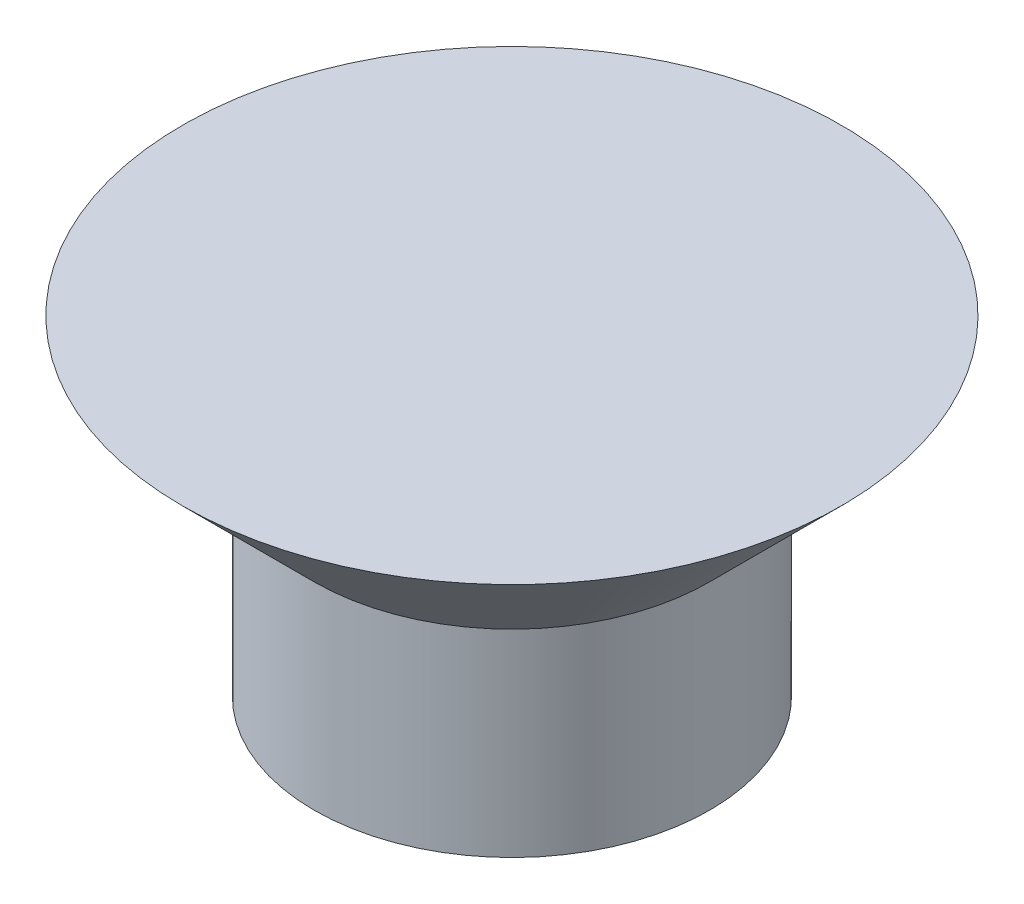
ISO-10303-21;
HEADER;
FILE_DESCRIPTION(('STEP AP214'),'2;1');
FILE_NAME('part.step','',(''),(''),'','','');
FILE_SCHEMA(('AUTOMOTIVE_DESIGN { 1 0 10303 214 1 1 1 1 }'));
ENDSEC;
DATA;
#1=APPLICATION_CONTEXT('core data for automotive mechanical design processes');
#2=APPLICATION_PROTOCOL_DEFINITION('international standard','automotive_design',2000,#1);
#3=PRODUCT_CONTEXT('',#1,'mechanical');
#4=PRODUCT('Part','Part','',(#3));
#5=PRODUCT_RELATED_PRODUCT_CATEGORY('part','',(#4));
#6=PRODUCT_DEFINITION_FORMATION('','',#4);
#7=PRODUCT_DEFINITION_CONTEXT('part definition',#1,'design');
#8=PRODUCT_DEFINITION('design','',#6,#7);
#9=PRODUCT_DEFINITION_SHAPE('','',#8);
#10=(LENGTH_UNIT() NAMED_UNIT(*) SI_UNIT(.MILLI.,.METRE.));
#11=(NAMED_UNIT(*) PLANE_ANGLE_UNIT() SI_UNIT($,.RADIAN.));
#12=(NAMED_UNIT(*) SI_UNIT($,.STERADIAN.) SOLID_ANGLE_UNIT());
#13=UNCERTAINTY_MEASURE_WITH_UNIT(LENGTH_MEASURE(1.E-05),#10,'distance_accuracy_value','');
#14=(GEOMETRIC_REPRESENTATION_CONTEXT(3) GLOBAL_UNCERTAINTY_ASSIGNED_CONTEXT((#13)) GLOBAL_UNIT_ASSIGNED_CONTEXT((#10,
#11,#12)) REPRESENTATION_CONTEXT('',''));
#15=CARTESIAN_POINT('',(0.,0.,0.));
#16=DIRECTION('',(0.,0.,1.));
#17=DIRECTION('',(1.,0.,0.));
#18=AXIS2_PLACEMENT_3D('',#15,#16,#17);
#19=CARTESIAN_POINT('',(-24.5037537537537,-38.9962462462462,0.));
#20=DIRECTION('',(0.,1.,0.));
#21=DIRECTION('',(0.,0.,1.));
#22=AXIS2_PLACEMENT_3D('',#19,#20,#21);
#23=PLANE('',#22);
#24=CARTESIAN_POINT('',(-24.5037537537537,-38.9962462462462,0.));
#25=DIRECTION('',(0.,1.,0.));
#26=DIRECTION('',(0.,0.,1.));
#27=AXIS2_PLACEMENT_3D('',#24,#25,#26);
#28=CIRCLE('',#27,1.5);
#29=CARTESIAN_POINT('',(-24.5037537537537,-38.9962462462462,1.5));
#30=VERTEX_POINT('',#29);
#31=EDGE_CURVE('E11',#30,#30,#28,.T.);
#32=ORIENTED_EDGE('',*,*,#31,.F.);
#33=EDGE_LOOP('',(#32));
#34=FACE_BOUND('',#33,.T.);
#35=ADVANCED_FACE('F40',(#34),#23,.F.);
#36=CARTESIAN_POINT('',(-24.5037537537537,-36.4962462462462,0.));
#37=DIRECTION('',(0.,1.,0.));
#38=DIRECTION('',(0.,0.,1.));
#39=AXIS2_PLACEMENT_3D('',#36,#37,#38);
#40=CYLINDRICAL_SURFACE('',#39,1.5);
#41=CARTESIAN_POINT('',(-24.5037537537537,-37.4962462462462,0.));
#42=DIRECTION('',(0.,1.,0.));
#43=DIRECTION('',(0.,0.,1.));
#44=AXIS2_PLACEMENT_3D('',#41,#42,#43);
#45=CIRCLE('',#44,1.5);
#46=CARTESIAN_POINT('',(-24.5037537537537,-37.4962462462462,1.5));
#47=VERTEX_POINT('',#46);
#48=EDGE_CURVE('E47',#47,#47,#45,.T.);
#49=ORIENTED_EDGE('',*,*,#48,.F.);
#50=EDGE_LOOP('',(#49));
#51=FACE_BOUND('',#50,.T.);
#52=ORIENTED_EDGE('',*,*,#31,.T.);
#53=EDGE_LOOP('',(#52));
#54=FACE_BOUND('',#53,.T.);
#55=ADVANCED_FACE('F64',(#51,#54),#40,.T.);
#56=CARTESIAN_POINT('',(-24.5037537537537,-37.4962462462462,0.));
#57=DIRECTION('',(0.,1.,0.));
#58=DIRECTION('',(0.,0.,1.));
#59=AXIS2_PLACEMENT_3D('',#56,#57,#58);
#60=CONICAL_SURFACE('',#59,1.5,0.785398163397445);
#61=CARTESIAN_POINT('',(-24.5037537537537,-36.4962462462462,0.));
#62=DIRECTION('',(0.,1.,0.));
#63=DIRECTION('',(0.,0.,1.));
#64=AXIS2_PLACEMENT_3D('',#61,#62,#63);
#65=CIRCLE('',#64,2.5);
#66=CARTESIAN_POINT('',(-24.5037537537537,-36.4962462462462,2.5));
#67=VERTEX_POINT('',#66);
#68=EDGE_CURVE('E52',#67,#67,#65,.T.);
#69=ORIENTED_EDGE('',*,*,#68,.F.);
#70=EDGE_LOOP('',(#69));
#71=FACE_BOUND('',#70,.T.);
#72=ORIENTED_EDGE('',*,*,#48,.T.);
#73=EDGE_LOOP('',(#72));
#74=FACE_BOUND('',#73,.T.);
#75=ADVANCED_FACE('F62',(#71,#74),#60,.T.);
#76=CARTESIAN_POINT('',(-24.5037537537537,-36.4962462462462,0.));
#77=DIRECTION('',(0.,-1.,0.));
#78=DIRECTION('',(0.,0.,-1.));
#79=AXIS2_PLACEMENT_3D('',#76,#77,#78);
#80=PLANE('',#79);
#81=ORIENTED_EDGE('',*,*,#68,.T.);
#82=EDGE_LOOP('',(#81));
#83=FACE_BOUND('',#82,.T.);
#84=ADVANCED_FACE('F60',(#83),#80,.F.);
#85=CLOSED_SHELL('',(#35,#55,#75,#84));
#86=MANIFOLD_SOLID_BREP('B2',#85);
#87=ADVANCED_BREP_SHAPE_REPRESENTATION('',(#18,#86),#14);
#88=SHAPE_DEFINITION_REPRESENTATION(#9,#87);
ENDSEC;
END-ISO-10303-21;
